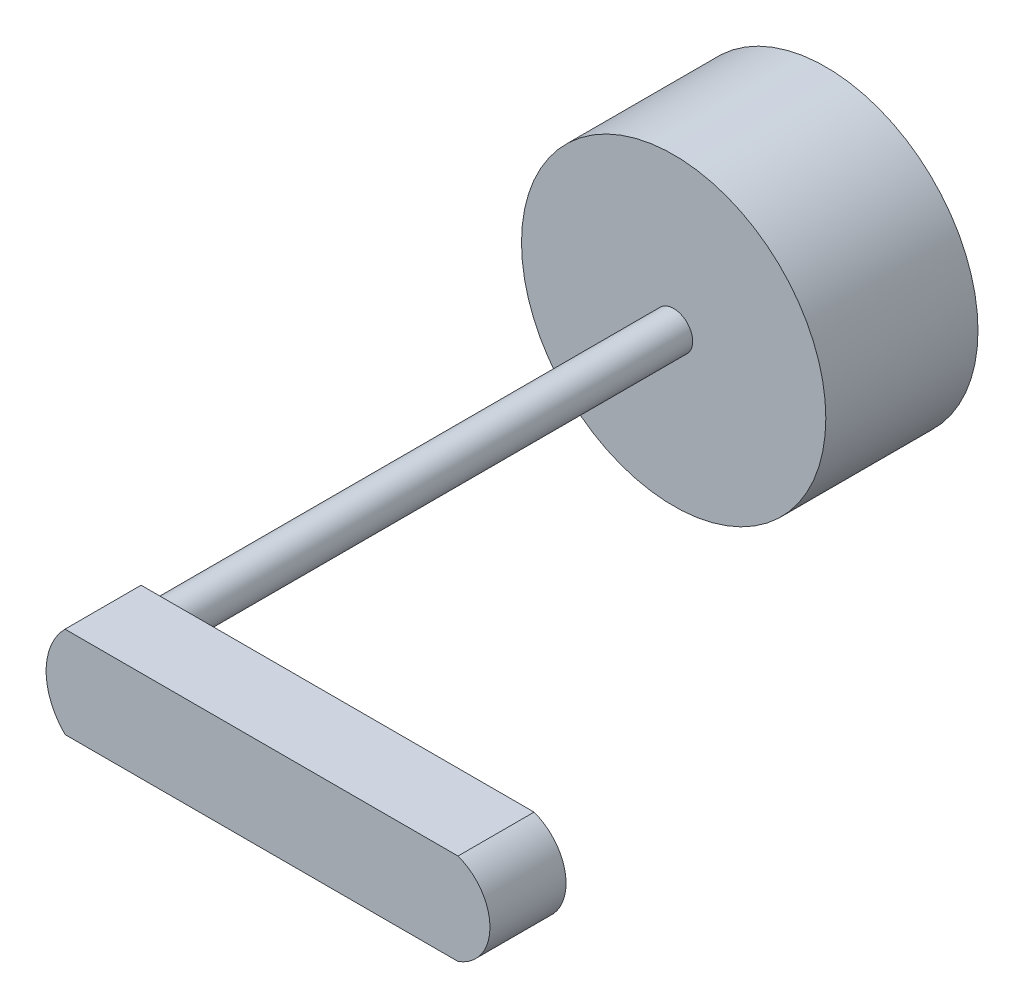
ISO-10303-21;
HEADER;
FILE_DESCRIPTION(('STEP AP214'),'2;1');
FILE_NAME('part.step','',(''),(''),'','','');
FILE_SCHEMA(('AUTOMOTIVE_DESIGN { 1 0 10303 214 1 1 1 1 }'));
ENDSEC;
DATA;
#1=APPLICATION_CONTEXT('core data for automotive mechanical design processes');
#2=APPLICATION_PROTOCOL_DEFINITION('international standard','automotive_design',2000,#1);
#3=PRODUCT_CONTEXT('',#1,'mechanical');
#4=PRODUCT('Part','Part','',(#3));
#5=PRODUCT_RELATED_PRODUCT_CATEGORY('part','',(#4));
#6=PRODUCT_DEFINITION_FORMATION('','',#4);
#7=PRODUCT_DEFINITION_CONTEXT('part definition',#1,'design');
#8=PRODUCT_DEFINITION('design','',#6,#7);
#9=PRODUCT_DEFINITION_SHAPE('','',#8);
#10=(LENGTH_UNIT() NAMED_UNIT(*) SI_UNIT(.MILLI.,.METRE.));
#11=(NAMED_UNIT(*) PLANE_ANGLE_UNIT() SI_UNIT($,.RADIAN.));
#12=(NAMED_UNIT(*) SI_UNIT($,.STERADIAN.) SOLID_ANGLE_UNIT());
#13=UNCERTAINTY_MEASURE_WITH_UNIT(LENGTH_MEASURE(1.E-05),#10,'distance_accuracy_value','');
#14=(GEOMETRIC_REPRESENTATION_CONTEXT(3) GLOBAL_UNCERTAINTY_ASSIGNED_CONTEXT((#13)) GLOBAL_UNIT_ASSIGNED_CONTEXT((#10,
#11,#12)) REPRESENTATION_CONTEXT('',''));
#15=CARTESIAN_POINT('',(0.,0.,0.));
#16=DIRECTION('',(0.,0.,1.));
#17=DIRECTION('',(1.,0.,0.));
#18=AXIS2_PLACEMENT_3D('',#15,#16,#17);
#19=CARTESIAN_POINT('',(0.,0.,10.));
#20=DIRECTION('',(0.,0.,-1.));
#21=DIRECTION('',(-1.,0.,0.));
#22=AXIS2_PLACEMENT_3D('',#19,#20,#21);
#23=CYLINDRICAL_SURFACE('',#22,10.);
#24=CARTESIAN_POINT('',(0.,0.,10.));
#25=DIRECTION('',(0.,0.,1.));
#26=DIRECTION('',(1.,0.,0.));
#27=AXIS2_PLACEMENT_3D('',#24,#25,#26);
#28=CIRCLE('',#27,10.);
#29=CARTESIAN_POINT('',(10.,0.,10.));
#30=VERTEX_POINT('',#29);
#31=EDGE_CURVE('E47',#30,#30,#28,.T.);
#32=ORIENTED_EDGE('',*,*,#31,.F.);
#33=EDGE_LOOP('',(#32));
#34=FACE_BOUND('',#33,.T.);
#35=CARTESIAN_POINT('',(0.,0.,0.));
#36=DIRECTION('',(0.,0.,1.));
#37=DIRECTION('',(1.,0.,0.));
#38=AXIS2_PLACEMENT_3D('',#35,#36,#37);
#39=CIRCLE('',#38,10.);
#40=CARTESIAN_POINT('',(10.,0.,0.));
#41=VERTEX_POINT('',#40);
#42=EDGE_CURVE('E157',#41,#41,#39,.T.);
#43=ORIENTED_EDGE('',*,*,#42,.T.);
#44=EDGE_LOOP('',(#43));
#45=FACE_BOUND('',#44,.T.);
#46=ADVANCED_FACE('F39',(#34,#45),#23,.T.);
#47=CARTESIAN_POINT('',(0.,0.,10.));
#48=DIRECTION('',(0.,0.,1.));
#49=DIRECTION('',(1.,0.,0.));
#50=AXIS2_PLACEMENT_3D('',#47,#48,#49);
#51=PLANE('',#50);
#52=CARTESIAN_POINT('',(0.,0.,10.));
#53=DIRECTION('',(0.,0.,1.));
#54=DIRECTION('',(1.,0.,0.));
#55=AXIS2_PLACEMENT_3D('',#52,#53,#54);
#56=CIRCLE('',#55,1.25);
#57=CARTESIAN_POINT('',(1.25,0.,10.));
#58=VERTEX_POINT('',#57);
#59=EDGE_CURVE('E153',#58,#58,#56,.T.);
#60=ORIENTED_EDGE('',*,*,#59,.F.);
#61=EDGE_LOOP('',(#60));
#62=FACE_BOUND('',#61,.T.);
#63=ORIENTED_EDGE('',*,*,#31,.T.);
#64=EDGE_LOOP('',(#63));
#65=FACE_BOUND('',#64,.T.);
#66=ADVANCED_FACE('F171',(#62,#65),#51,.T.);
#67=CARTESIAN_POINT('',(0.,0.,0.));
#68=DIRECTION('',(0.,0.,1.));
#69=DIRECTION('',(1.,0.,0.));
#70=AXIS2_PLACEMENT_3D('',#67,#68,#69);
#71=PLANE('',#70);
#72=ORIENTED_EDGE('',*,*,#42,.F.);
#73=EDGE_LOOP('',(#72));
#74=FACE_BOUND('',#73,.T.);
#75=ADVANCED_FACE('F168',(#74),#71,.F.);
#76=CARTESIAN_POINT('',(0.,0.,50.));
#77=DIRECTION('',(0.,0.,-1.));
#78=DIRECTION('',(-1.,0.,0.));
#79=AXIS2_PLACEMENT_3D('',#76,#77,#78);
#80=CYLINDRICAL_SURFACE('',#79,1.25);
#81=CARTESIAN_POINT('',(0.,0.,45.));
#82=DIRECTION('',(0.,0.,1.));
#83=DIRECTION('',(1.,0.,0.));
#84=AXIS2_PLACEMENT_3D('',#81,#82,#83);
#85=CIRCLE('',#84,1.25);
#86=CARTESIAN_POINT('',(-1.23958333333333,-0.161037758684801,45.));
#87=VERTEX_POINT('',#86);
#88=CARTESIAN_POINT('',(-1.23958333333333,0.161037758684801,45.));
#89=VERTEX_POINT('',#88);
#90=EDGE_CURVE('E11',#87,#89,#85,.T.);
#91=ORIENTED_EDGE('',*,*,#90,.F.);
#92=DIRECTION('',(0.,0.,1.));
#93=VECTOR('',#92,1.);
#94=CARTESIAN_POINT('',(-1.23958333333333,-0.161037758684803,47.5));
#95=LINE('',#94,#93);
#96=CARTESIAN_POINT('',(-1.23958333333333,-0.161037758684803,50.));
#97=VERTEX_POINT('',#96);
#98=EDGE_CURVE('E62',#87,#97,#95,.T.);
#99=ORIENTED_EDGE('',*,*,#98,.T.);
#100=CARTESIAN_POINT('',(0.,0.,50.));
#101=DIRECTION('',(0.,0.,1.));
#102=DIRECTION('',(1.,0.,0.));
#103=AXIS2_PLACEMENT_3D('',#100,#101,#102);
#104=CIRCLE('',#103,1.25);
#105=CARTESIAN_POINT('',(-1.23958333333333,0.161037758684803,50.));
#106=VERTEX_POINT('',#105);
#107=EDGE_CURVE('E154',#106,#97,#104,.T.);
#108=ORIENTED_EDGE('',*,*,#107,.F.);
#109=DIRECTION('',(0.,0.,1.));
#110=VECTOR('',#109,1.);
#111=CARTESIAN_POINT('',(-1.23958333333333,0.161037758684803,47.5));
#112=LINE('',#111,#110);
#113=EDGE_CURVE('E142',#106,#89,#112,.F.);
#114=ORIENTED_EDGE('',*,*,#113,.T.);
#115=EDGE_LOOP('',(#91,#99,#108,#114));
#116=FACE_BOUND('',#115,.T.);
#117=ORIENTED_EDGE('',*,*,#59,.T.);
#118=EDGE_LOOP('',(#117));
#119=FACE_BOUND('',#118,.T.);
#120=ADVANCED_FACE('F170',(#116,#119),#80,.T.);
#121=CARTESIAN_POINT('',(0.,0.,50.));
#122=DIRECTION('',(0.,0.,1.));
#123=DIRECTION('',(1.,0.,0.));
#124=AXIS2_PLACEMENT_3D('',#121,#122,#123);
#125=PLANE('',#124);
#126=ORIENTED_EDGE('',*,*,#107,.T.);
#127=CARTESIAN_POINT('',(3.,0.,50.));
#128=DIRECTION('',(0.,0.,1.));
#129=DIRECTION('',(1.,0.,0.));
#130=AXIS2_PLACEMENT_3D('',#127,#128,#129);
#131=CIRCLE('',#130,4.24264068711929);
#132=CARTESIAN_POINT('',(0.,-3.,50.));
#133=VERTEX_POINT('',#132);
#134=EDGE_CURVE('E130',#97,#133,#131,.T.);
#135=ORIENTED_EDGE('',*,*,#134,.T.);
#136=DIRECTION('',(1.,0.,0.));
#137=VECTOR('',#136,1.);
#138=CARTESIAN_POINT('',(0.,-3.,50.));
#139=LINE('',#138,#137);
#140=CARTESIAN_POINT('',(25.8270624728816,-3.,50.));
#141=VERTEX_POINT('',#140);
#142=EDGE_CURVE('E108',#133,#141,#139,.T.);
#143=ORIENTED_EDGE('',*,*,#142,.T.);
#144=CARTESIAN_POINT('',(24.735455290167,0.,50.));
#145=DIRECTION('',(0.,0.,1.));
#146=DIRECTION('',(-1.,0.,0.));
#147=AXIS2_PLACEMENT_3D('',#144,#145,#146);
#148=CIRCLE('',#147,3.19242952018585);
#149=CARTESIAN_POINT('',(25.8270624728816,3.,50.));
#150=VERTEX_POINT('',#149);
#151=EDGE_CURVE('E133',#141,#150,#148,.T.);
#152=ORIENTED_EDGE('',*,*,#151,.T.);
#153=DIRECTION('',(-1.,0.,0.));
#154=VECTOR('',#153,1.);
#155=CARTESIAN_POINT('',(0.,3.,50.));
#156=LINE('',#155,#154);
#157=CARTESIAN_POINT('',(0.,3.,50.));
#158=VERTEX_POINT('',#157);
#159=EDGE_CURVE('E101',#150,#158,#156,.T.);
#160=ORIENTED_EDGE('',*,*,#159,.T.);
#161=EDGE_CURVE('E54',#158,#106,#131,.T.);
#162=ORIENTED_EDGE('',*,*,#161,.T.);
#163=EDGE_LOOP('',(#126,#135,#143,#152,#160,#162));
#164=FACE_BOUND('',#163,.T.);
#165=ADVANCED_FACE('F176',(#164),#125,.T.);
#166=CARTESIAN_POINT('',(3.,0.,45.));
#167=DIRECTION('',(0.,0.,1.));
#168=DIRECTION('',(1.,0.,0.));
#169=AXIS2_PLACEMENT_3D('',#166,#167,#168);
#170=CYLINDRICAL_SURFACE('',#169,4.24264068711929);
#171=ORIENTED_EDGE('',*,*,#98,.F.);
#172=CARTESIAN_POINT('',(3.,0.,45.));
#173=DIRECTION('',(0.,0.,1.));
#174=DIRECTION('',(1.,0.,0.));
#175=AXIS2_PLACEMENT_3D('',#172,#173,#174);
#176=CIRCLE('',#175,4.24264068711929);
#177=CARTESIAN_POINT('',(0.,-3.,45.));
#178=VERTEX_POINT('',#177);
#179=EDGE_CURVE('E91',#87,#178,#176,.T.);
#180=ORIENTED_EDGE('',*,*,#179,.T.);
#181=DIRECTION('',(0.,0.,1.));
#182=VECTOR('',#181,1.);
#183=CARTESIAN_POINT('',(0.,-3.,45.));
#184=LINE('',#183,#182);
#185=EDGE_CURVE('E94',#178,#133,#184,.T.);
#186=ORIENTED_EDGE('',*,*,#185,.T.);
#187=ORIENTED_EDGE('',*,*,#134,.F.);
#188=EDGE_LOOP('',(#171,#180,#186,#187));
#189=FACE_BOUND('',#188,.T.);
#190=ADVANCED_FACE('F93',(#189),#170,.T.);
#191=ORIENTED_EDGE('',*,*,#113,.F.);
#192=ORIENTED_EDGE('',*,*,#161,.F.);
#193=DIRECTION('',(0.,0.,1.));
#194=VECTOR('',#193,1.);
#195=CARTESIAN_POINT('',(0.,3.,45.));
#196=LINE('',#195,#194);
#197=CARTESIAN_POINT('',(0.,3.,45.));
#198=VERTEX_POINT('',#197);
#199=EDGE_CURVE('E139',#198,#158,#196,.T.);
#200=ORIENTED_EDGE('',*,*,#199,.F.);
#201=EDGE_CURVE('E100',#198,#89,#176,.T.);
#202=ORIENTED_EDGE('',*,*,#201,.T.);
#203=EDGE_LOOP('',(#191,#192,#200,#202));
#204=FACE_BOUND('',#203,.T.);
#205=ADVANCED_FACE('F217',(#204),#170,.T.);
#206=CARTESIAN_POINT('',(0.,3.,45.));
#207=DIRECTION('',(0.,1.,0.));
#208=DIRECTION('',(0.,0.,1.));
#209=AXIS2_PLACEMENT_3D('',#206,#207,#208);
#210=PLANE('',#209);
#211=ORIENTED_EDGE('',*,*,#159,.F.);
#212=DIRECTION('',(0.,0.,1.));
#213=VECTOR('',#212,1.);
#214=CARTESIAN_POINT('',(25.8270624728816,3.,45.));
#215=LINE('',#214,#213);
#216=CARTESIAN_POINT('',(25.8270624728816,3.,45.));
#217=VERTEX_POINT('',#216);
#218=EDGE_CURVE('E143',#217,#150,#215,.T.);
#219=ORIENTED_EDGE('',*,*,#218,.F.);
#220=DIRECTION('',(-1.,0.,0.));
#221=VECTOR('',#220,1.);
#222=CARTESIAN_POINT('',(0.,3.,45.));
#223=LINE('',#222,#221);
#224=EDGE_CURVE('E111',#217,#198,#223,.T.);
#225=ORIENTED_EDGE('',*,*,#224,.T.);
#226=ORIENTED_EDGE('',*,*,#199,.T.);
#227=EDGE_LOOP('',(#211,#219,#225,#226));
#228=FACE_BOUND('',#227,.T.);
#229=ADVANCED_FACE('F226',(#228),#210,.T.);
#230=CARTESIAN_POINT('',(24.735455290167,0.,45.));
#231=DIRECTION('',(0.,0.,1.));
#232=DIRECTION('',(1.,0.,0.));
#233=AXIS2_PLACEMENT_3D('',#230,#231,#232);
#234=CYLINDRICAL_SURFACE('',#233,3.19242952018585);
#235=ORIENTED_EDGE('',*,*,#151,.F.);
#236=DIRECTION('',(0.,0.,1.));
#237=VECTOR('',#236,1.);
#238=CARTESIAN_POINT('',(25.8270624728816,-3.,45.));
#239=LINE('',#238,#237);
#240=CARTESIAN_POINT('',(25.8270624728816,-3.,45.));
#241=VERTEX_POINT('',#240);
#242=EDGE_CURVE('E110',#241,#141,#239,.T.);
#243=ORIENTED_EDGE('',*,*,#242,.F.);
#244=CARTESIAN_POINT('',(24.735455290167,0.,45.));
#245=DIRECTION('',(0.,0.,1.));
#246=DIRECTION('',(-1.,0.,0.));
#247=AXIS2_PLACEMENT_3D('',#244,#245,#246);
#248=CIRCLE('',#247,3.19242952018585);
#249=EDGE_CURVE('E117',#241,#217,#248,.T.);
#250=ORIENTED_EDGE('',*,*,#249,.T.);
#251=ORIENTED_EDGE('',*,*,#218,.T.);
#252=EDGE_LOOP('',(#235,#243,#250,#251));
#253=FACE_BOUND('',#252,.T.);
#254=ADVANCED_FACE('F235',(#253),#234,.T.);
#255=CARTESIAN_POINT('',(0.,-3.,45.));
#256=DIRECTION('',(0.,-1.,0.));
#257=DIRECTION('',(0.,0.,-1.));
#258=AXIS2_PLACEMENT_3D('',#255,#256,#257);
#259=PLANE('',#258);
#260=ORIENTED_EDGE('',*,*,#142,.F.);
#261=ORIENTED_EDGE('',*,*,#185,.F.);
#262=DIRECTION('',(1.,0.,0.));
#263=VECTOR('',#262,1.);
#264=CARTESIAN_POINT('',(0.,-3.,45.));
#265=LINE('',#264,#263);
#266=EDGE_CURVE('E106',#178,#241,#265,.T.);
#267=ORIENTED_EDGE('',*,*,#266,.T.);
#268=ORIENTED_EDGE('',*,*,#242,.T.);
#269=EDGE_LOOP('',(#260,#261,#267,#268));
#270=FACE_BOUND('',#269,.T.);
#271=ADVANCED_FACE('F105',(#270),#259,.T.);
#272=CARTESIAN_POINT('',(3.,0.,45.));
#273=DIRECTION('',(0.,0.,1.));
#274=DIRECTION('',(1.,0.,0.));
#275=AXIS2_PLACEMENT_3D('',#272,#273,#274);
#276=PLANE('',#275);
#277=ORIENTED_EDGE('',*,*,#179,.F.);
#278=ORIENTED_EDGE('',*,*,#90,.T.);
#279=ORIENTED_EDGE('',*,*,#201,.F.);
#280=ORIENTED_EDGE('',*,*,#224,.F.);
#281=ORIENTED_EDGE('',*,*,#249,.F.);
#282=ORIENTED_EDGE('',*,*,#266,.F.);
#283=EDGE_LOOP('',(#277,#278,#279,#280,#281,#282));
#284=FACE_BOUND('',#283,.T.);
#285=ADVANCED_FACE('F114',(#284),#276,.F.);
#286=CLOSED_SHELL('',(#46,#66,#75,#120,#165,#190,#205,#229,#254,#271,#285));
#287=MANIFOLD_SOLID_BREP('B2',#286);
#288=ADVANCED_BREP_SHAPE_REPRESENTATION('',(#18,#287),#14);
#289=SHAPE_DEFINITION_REPRESENTATION(#9,#288);
ENDSEC;
END-ISO-10303-21;
